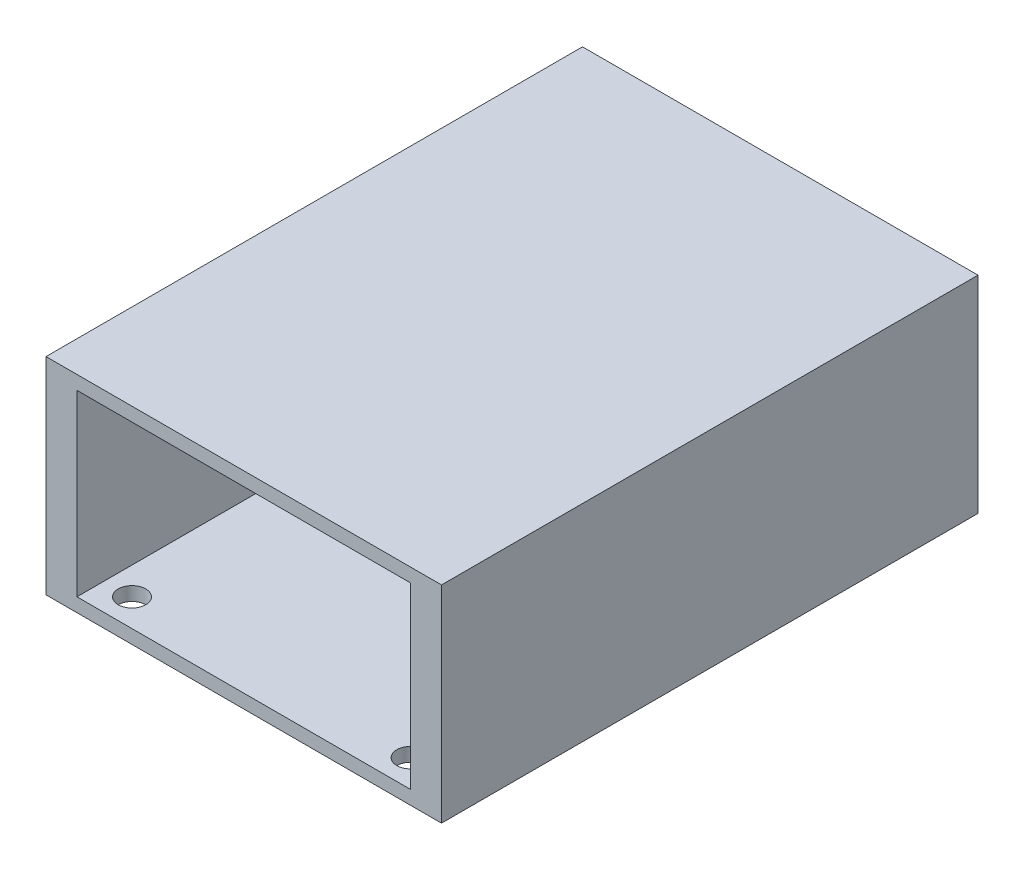
ISO-10303-21;
HEADER;
FILE_DESCRIPTION(('STEP AP214'),'2;1');
FILE_NAME('part.step','',(''),(''),'','','');
FILE_SCHEMA(('AUTOMOTIVE_DESIGN { 1 0 10303 214 1 1 1 1 }'));
ENDSEC;
DATA;
#1=APPLICATION_CONTEXT('core data for automotive mechanical design processes');
#2=APPLICATION_PROTOCOL_DEFINITION('international standard','automotive_design',2000,#1);
#3=PRODUCT_CONTEXT('',#1,'mechanical');
#4=PRODUCT('Part','Part','',(#3));
#5=PRODUCT_RELATED_PRODUCT_CATEGORY('part','',(#4));
#6=PRODUCT_DEFINITION_FORMATION('','',#4);
#7=PRODUCT_DEFINITION_CONTEXT('part definition',#1,'design');
#8=PRODUCT_DEFINITION('design','',#6,#7);
#9=PRODUCT_DEFINITION_SHAPE('','',#8);
#10=(LENGTH_UNIT() NAMED_UNIT(*) SI_UNIT(.MILLI.,.METRE.));
#11=(NAMED_UNIT(*) PLANE_ANGLE_UNIT() SI_UNIT($,.RADIAN.));
#12=(NAMED_UNIT(*) SI_UNIT($,.STERADIAN.) SOLID_ANGLE_UNIT());
#13=UNCERTAINTY_MEASURE_WITH_UNIT(LENGTH_MEASURE(1.E-05),#10,'distance_accuracy_value','');
#14=(GEOMETRIC_REPRESENTATION_CONTEXT(3) GLOBAL_UNCERTAINTY_ASSIGNED_CONTEXT((#13)) GLOBAL_UNIT_ASSIGNED_CONTEXT((#10,
#11,#12)) REPRESENTATION_CONTEXT('',''));
#15=CARTESIAN_POINT('',(0.,0.,0.));
#16=DIRECTION('',(0.,0.,1.));
#17=DIRECTION('',(1.,0.,0.));
#18=AXIS2_PLACEMENT_3D('',#15,#16,#17);
#19=CARTESIAN_POINT('',(-33.5980392156863,30.,-40.2303921568627));
#20=DIRECTION('',(1.,0.,0.));
#21=DIRECTION('',(0.,0.,-1.));
#22=AXIS2_PLACEMENT_3D('',#19,#20,#21);
#23=PLANE('',#22);
#24=DIRECTION('',(0.,0.,1.));
#25=VECTOR('',#24,1.);
#26=CARTESIAN_POINT('',(-33.5980392156863,0.,-40.2303921568627));
#27=LINE('',#26,#25);
#28=CARTESIAN_POINT('',(-33.5980392156863,0.,-40.2303921568627));
#29=VERTEX_POINT('',#28);
#30=CARTESIAN_POINT('',(-33.5980392156863,0.,37.7696078431373));
#31=VERTEX_POINT('',#30);
#32=EDGE_CURVE('E145',#29,#31,#27,.T.);
#33=ORIENTED_EDGE('',*,*,#32,.T.);
#34=DIRECTION('',(0.,-1.,0.));
#35=VECTOR('',#34,1.);
#36=CARTESIAN_POINT('',(-33.5980392156863,30.,37.7696078431373));
#37=LINE('',#36,#35);
#38=CARTESIAN_POINT('',(-33.5980392156863,30.,37.7696078431373));
#39=VERTEX_POINT('',#38);
#40=EDGE_CURVE('E11',#39,#31,#37,.T.);
#41=ORIENTED_EDGE('',*,*,#40,.F.);
#42=DIRECTION('',(0.,0.,1.));
#43=VECTOR('',#42,1.);
#44=CARTESIAN_POINT('',(-33.5980392156863,30.,-40.2303921568627));
#45=LINE('',#44,#43);
#46=CARTESIAN_POINT('',(-33.5980392156863,30.,-40.2303921568627));
#47=VERTEX_POINT('',#46);
#48=EDGE_CURVE('E149',#47,#39,#45,.T.);
#49=ORIENTED_EDGE('',*,*,#48,.F.);
#50=DIRECTION('',(0.,-1.,0.));
#51=VECTOR('',#50,1.);
#52=CARTESIAN_POINT('',(-33.5980392156863,30.,-40.2303921568627));
#53=LINE('',#52,#51);
#54=EDGE_CURVE('E155',#47,#29,#53,.T.);
#55=ORIENTED_EDGE('',*,*,#54,.T.);
#56=EDGE_LOOP('',(#33,#41,#49,#55));
#57=FACE_BOUND('',#56,.T.);
#58=ADVANCED_FACE('F33',(#57),#23,.F.);
#59=CARTESIAN_POINT('',(-33.5980392156863,30.,37.7696078431373));
#60=DIRECTION('',(0.,0.,-1.));
#61=DIRECTION('',(-1.,0.,0.));
#62=AXIS2_PLACEMENT_3D('',#59,#60,#61);
#63=PLANE('',#62);
#64=DIRECTION('',(1.,0.,0.));
#65=VECTOR('',#64,1.);
#66=CARTESIAN_POINT('',(-29.0980392156863,2.,37.7696078431373));
#67=LINE('',#66,#65);
#68=CARTESIAN_POINT('',(-29.0980392156863,2.,37.7696078431373));
#69=VERTEX_POINT('',#68);
#70=CARTESIAN_POINT('',(19.4019607843137,2.,37.7696078431373));
#71=VERTEX_POINT('',#70);
#72=EDGE_CURVE('E138',#69,#71,#67,.T.);
#73=ORIENTED_EDGE('',*,*,#72,.F.);
#74=DIRECTION('',(0.,-1.,0.));
#75=VECTOR('',#74,1.);
#76=CARTESIAN_POINT('',(-29.0980392156863,28.,37.7696078431373));
#77=LINE('',#76,#75);
#78=CARTESIAN_POINT('',(-29.0980392156863,28.,37.7696078431373));
#79=VERTEX_POINT('',#78);
#80=EDGE_CURVE('E47',#79,#69,#77,.T.);
#81=ORIENTED_EDGE('',*,*,#80,.F.);
#82=DIRECTION('',(-1.,0.,0.));
#83=VECTOR('',#82,1.);
#84=CARTESIAN_POINT('',(-29.0980392156863,28.,37.7696078431373));
#85=LINE('',#84,#83);
#86=CARTESIAN_POINT('',(19.4019607843137,28.,37.7696078431373));
#87=VERTEX_POINT('',#86);
#88=EDGE_CURVE('E126',#87,#79,#85,.T.);
#89=ORIENTED_EDGE('',*,*,#88,.F.);
#90=DIRECTION('',(0.,1.,0.));
#91=VECTOR('',#90,1.);
#92=CARTESIAN_POINT('',(19.4019607843137,28.,37.7696078431373));
#93=LINE('',#92,#91);
#94=EDGE_CURVE('E129',#71,#87,#93,.T.);
#95=ORIENTED_EDGE('',*,*,#94,.F.);
#96=EDGE_LOOP('',(#73,#81,#89,#95));
#97=FACE_BOUND('',#96,.T.);
#98=DIRECTION('',(1.,0.,0.));
#99=VECTOR('',#98,1.);
#100=CARTESIAN_POINT('',(-33.5980392156863,0.,37.7696078431373));
#101=LINE('',#100,#99);
#102=CARTESIAN_POINT('',(23.9019607843137,0.,37.7696078431373));
#103=VERTEX_POINT('',#102);
#104=EDGE_CURVE('E158',#31,#103,#101,.T.);
#105=ORIENTED_EDGE('',*,*,#104,.T.);
#106=DIRECTION('',(0.,-1.,0.));
#107=VECTOR('',#106,1.);
#108=CARTESIAN_POINT('',(23.9019607843137,30.,37.7696078431373));
#109=LINE('',#108,#107);
#110=CARTESIAN_POINT('',(23.9019607843137,30.,37.7696078431373));
#111=VERTEX_POINT('',#110);
#112=EDGE_CURVE('E40',#111,#103,#109,.T.);
#113=ORIENTED_EDGE('',*,*,#112,.F.);
#114=DIRECTION('',(1.,0.,0.));
#115=VECTOR('',#114,1.);
#116=CARTESIAN_POINT('',(-33.5980392156863,30.,37.7696078431373));
#117=LINE('',#116,#115);
#118=EDGE_CURVE('E84',#39,#111,#117,.T.);
#119=ORIENTED_EDGE('',*,*,#118,.F.);
#120=ORIENTED_EDGE('',*,*,#40,.T.);
#121=EDGE_LOOP('',(#105,#113,#119,#120));
#122=FACE_BOUND('',#121,.T.);
#123=ADVANCED_FACE('F186',(#97,#122),#63,.F.);
#124=CARTESIAN_POINT('',(23.9019607843137,30.,-40.2303921568627));
#125=DIRECTION('',(-1.,0.,0.));
#126=DIRECTION('',(0.,0.,1.));
#127=AXIS2_PLACEMENT_3D('',#124,#125,#126);
#128=PLANE('',#127);
#129=DIRECTION('',(0.,0.,-1.));
#130=VECTOR('',#129,1.);
#131=CARTESIAN_POINT('',(23.9019607843137,0.,-40.2303921568627));
#132=LINE('',#131,#130);
#133=CARTESIAN_POINT('',(23.9019607843137,0.,-40.2303921568627));
#134=VERTEX_POINT('',#133);
#135=EDGE_CURVE('E160',#103,#134,#132,.T.);
#136=ORIENTED_EDGE('',*,*,#135,.T.);
#137=DIRECTION('',(0.,-1.,0.));
#138=VECTOR('',#137,1.);
#139=CARTESIAN_POINT('',(23.9019607843137,30.,-40.2303921568627));
#140=LINE('',#139,#138);
#141=CARTESIAN_POINT('',(23.9019607843137,30.,-40.2303921568627));
#142=VERTEX_POINT('',#141);
#143=EDGE_CURVE('E164',#142,#134,#140,.T.);
#144=ORIENTED_EDGE('',*,*,#143,.F.);
#145=DIRECTION('',(0.,0.,-1.));
#146=VECTOR('',#145,1.);
#147=CARTESIAN_POINT('',(23.9019607843137,30.,-40.2303921568627));
#148=LINE('',#147,#146);
#149=EDGE_CURVE('E152',#111,#142,#148,.T.);
#150=ORIENTED_EDGE('',*,*,#149,.F.);
#151=ORIENTED_EDGE('',*,*,#112,.T.);
#152=EDGE_LOOP('',(#136,#144,#150,#151));
#153=FACE_BOUND('',#152,.T.);
#154=ADVANCED_FACE('F169',(#153),#128,.F.);
#155=CARTESIAN_POINT('',(-33.5980392156863,30.,-40.2303921568627));
#156=DIRECTION('',(0.,0.,1.));
#157=DIRECTION('',(1.,0.,0.));
#158=AXIS2_PLACEMENT_3D('',#155,#156,#157);
#159=PLANE('',#158);
#160=DIRECTION('',(-1.,0.,0.));
#161=VECTOR('',#160,1.);
#162=CARTESIAN_POINT('',(-33.5980392156863,0.,-40.2303921568627));
#163=LINE('',#162,#161);
#164=EDGE_CURVE('E77',#134,#29,#163,.T.);
#165=ORIENTED_EDGE('',*,*,#164,.T.);
#166=ORIENTED_EDGE('',*,*,#54,.F.);
#167=DIRECTION('',(-1.,0.,0.));
#168=VECTOR('',#167,1.);
#169=CARTESIAN_POINT('',(-33.5980392156863,30.,-40.2303921568627));
#170=LINE('',#169,#168);
#171=EDGE_CURVE('E56',#142,#47,#170,.T.);
#172=ORIENTED_EDGE('',*,*,#171,.F.);
#173=ORIENTED_EDGE('',*,*,#143,.T.);
#174=EDGE_LOOP('',(#165,#166,#172,#173));
#175=FACE_BOUND('',#174,.T.);
#176=ADVANCED_FACE('F177',(#175),#159,.F.);
#177=CARTESIAN_POINT('',(0.,30.,0.));
#178=DIRECTION('',(0.,1.,0.));
#179=DIRECTION('',(0.,0.,1.));
#180=AXIS2_PLACEMENT_3D('',#177,#178,#179);
#181=PLANE('',#180);
#182=ORIENTED_EDGE('',*,*,#48,.T.);
#183=ORIENTED_EDGE('',*,*,#118,.T.);
#184=ORIENTED_EDGE('',*,*,#149,.T.);
#185=ORIENTED_EDGE('',*,*,#171,.T.);
#186=EDGE_LOOP('',(#182,#183,#184,#185));
#187=FACE_BOUND('',#186,.T.);
#188=ADVANCED_FACE('F179',(#187),#181,.T.);
#189=CARTESIAN_POINT('',(0.,0.,0.));
#190=DIRECTION('',(0.,1.,0.));
#191=DIRECTION('',(0.,0.,1.));
#192=AXIS2_PLACEMENT_3D('',#189,#190,#191);
#193=PLANE('',#192);
#194=CARTESIAN_POINT('',(-25.0980392156863,0.,33.7696078431373));
#195=DIRECTION('',(0.,1.,0.));
#196=DIRECTION('',(0.,0.,1.));
#197=AXIS2_PLACEMENT_3D('',#194,#195,#196);
#198=CIRCLE('',#197,2.00000000000001);
#199=CARTESIAN_POINT('',(-25.0980392156863,0.,35.7696078431373));
#200=VERTEX_POINT('',#199);
#201=EDGE_CURVE('E222',#200,#200,#198,.T.);
#202=ORIENTED_EDGE('',*,*,#201,.T.);
#203=EDGE_LOOP('',(#202));
#204=FACE_BOUND('',#203,.T.);
#205=CARTESIAN_POINT('',(-25.0980392156863,0.,-34.2303921568628));
#206=DIRECTION('',(0.,1.,0.));
#207=DIRECTION('',(0.,0.,1.));
#208=AXIS2_PLACEMENT_3D('',#205,#206,#207);
#209=CIRCLE('',#208,1.);
#210=CARTESIAN_POINT('',(-25.0980392156863,0.,-33.2303921568628));
#211=VERTEX_POINT('',#210);
#212=EDGE_CURVE('E226',#211,#211,#209,.T.);
#213=ORIENTED_EDGE('',*,*,#212,.T.);
#214=EDGE_LOOP('',(#213));
#215=FACE_BOUND('',#214,.T.);
#216=CARTESIAN_POINT('',(15.4019607843137,0.,33.7696078431373));
#217=DIRECTION('',(0.,1.,0.));
#218=DIRECTION('',(0.,0.,1.));
#219=AXIS2_PLACEMENT_3D('',#216,#217,#218);
#220=CIRCLE('',#219,2.);
#221=CARTESIAN_POINT('',(15.4019607843137,0.,35.7696078431373));
#222=VERTEX_POINT('',#221);
#223=EDGE_CURVE('E139',#222,#222,#220,.T.);
#224=ORIENTED_EDGE('',*,*,#223,.T.);
#225=EDGE_LOOP('',(#224));
#226=FACE_BOUND('',#225,.T.);
#227=ORIENTED_EDGE('',*,*,#32,.F.);
#228=ORIENTED_EDGE('',*,*,#164,.F.);
#229=ORIENTED_EDGE('',*,*,#135,.F.);
#230=ORIENTED_EDGE('',*,*,#104,.F.);
#231=EDGE_LOOP('',(#227,#228,#229,#230));
#232=FACE_BOUND('',#231,.T.);
#233=ADVANCED_FACE('F173',(#204,#215,#226,#232),#193,.F.);
#234=CARTESIAN_POINT('',(-29.0980392156863,28.,-38.2303921568628));
#235=DIRECTION('',(-1.,0.,0.));
#236=DIRECTION('',(0.,-1.,0.));
#237=AXIS2_PLACEMENT_3D('',#234,#235,#236);
#238=PLANE('',#237);
#239=ORIENTED_EDGE('',*,*,#80,.T.);
#240=DIRECTION('',(0.,0.,1.));
#241=VECTOR('',#240,1.);
#242=CARTESIAN_POINT('',(-29.0980392156863,2.,-38.2303921568628));
#243=LINE('',#242,#241);
#244=CARTESIAN_POINT('',(-29.0980392156863,2.,-38.2303921568628));
#245=VERTEX_POINT('',#244);
#246=EDGE_CURVE('E104',#245,#69,#243,.T.);
#247=ORIENTED_EDGE('',*,*,#246,.F.);
#248=DIRECTION('',(0.,-1.,0.));
#249=VECTOR('',#248,1.);
#250=CARTESIAN_POINT('',(-29.0980392156863,28.,-38.2303921568628));
#251=LINE('',#250,#249);
#252=CARTESIAN_POINT('',(-29.0980392156863,28.,-38.2303921568628));
#253=VERTEX_POINT('',#252);
#254=EDGE_CURVE('E108',#253,#245,#251,.T.);
#255=ORIENTED_EDGE('',*,*,#254,.F.);
#256=DIRECTION('',(0.,0.,1.));
#257=VECTOR('',#256,1.);
#258=CARTESIAN_POINT('',(-29.0980392156863,28.,-38.2303921568628));
#259=LINE('',#258,#257);
#260=EDGE_CURVE('E143',#253,#79,#259,.T.);
#261=ORIENTED_EDGE('',*,*,#260,.T.);
#262=EDGE_LOOP('',(#239,#247,#255,#261));
#263=FACE_BOUND('',#262,.T.);
#264=ADVANCED_FACE('F106',(#263),#238,.F.);
#265=CARTESIAN_POINT('',(-29.0980392156863,28.,-38.2303921568628));
#266=DIRECTION('',(0.,1.,0.));
#267=DIRECTION('',(0.,0.,1.));
#268=AXIS2_PLACEMENT_3D('',#265,#266,#267);
#269=PLANE('',#268);
#270=ORIENTED_EDGE('',*,*,#88,.T.);
#271=ORIENTED_EDGE('',*,*,#260,.F.);
#272=DIRECTION('',(-1.,0.,0.));
#273=VECTOR('',#272,1.);
#274=CARTESIAN_POINT('',(-29.0980392156863,28.,-38.2303921568628));
#275=LINE('',#274,#273);
#276=CARTESIAN_POINT('',(19.4019607843137,28.,-38.2303921568628));
#277=VERTEX_POINT('',#276);
#278=EDGE_CURVE('E114',#277,#253,#275,.T.);
#279=ORIENTED_EDGE('',*,*,#278,.F.);
#280=DIRECTION('',(0.,0.,1.));
#281=VECTOR('',#280,1.);
#282=CARTESIAN_POINT('',(19.4019607843137,28.,-38.2303921568628));
#283=LINE('',#282,#281);
#284=EDGE_CURVE('E146',#277,#87,#283,.T.);
#285=ORIENTED_EDGE('',*,*,#284,.T.);
#286=EDGE_LOOP('',(#270,#271,#279,#285));
#287=FACE_BOUND('',#286,.T.);
#288=ADVANCED_FACE('F201',(#287),#269,.F.);
#289=CARTESIAN_POINT('',(19.4019607843137,28.,-38.2303921568628));
#290=DIRECTION('',(1.,0.,0.));
#291=DIRECTION('',(0.,1.,0.));
#292=AXIS2_PLACEMENT_3D('',#289,#290,#291);
#293=PLANE('',#292);
#294=ORIENTED_EDGE('',*,*,#94,.T.);
#295=ORIENTED_EDGE('',*,*,#284,.F.);
#296=DIRECTION('',(0.,1.,0.));
#297=VECTOR('',#296,1.);
#298=CARTESIAN_POINT('',(19.4019607843137,28.,-38.2303921568628));
#299=LINE('',#298,#297);
#300=CARTESIAN_POINT('',(19.4019607843137,2.,-38.2303921568628));
#301=VERTEX_POINT('',#300);
#302=EDGE_CURVE('E122',#301,#277,#299,.T.);
#303=ORIENTED_EDGE('',*,*,#302,.F.);
#304=DIRECTION('',(0.,0.,1.));
#305=VECTOR('',#304,1.);
#306=CARTESIAN_POINT('',(19.4019607843137,2.,-38.2303921568628));
#307=LINE('',#306,#305);
#308=EDGE_CURVE('E113',#301,#71,#307,.T.);
#309=ORIENTED_EDGE('',*,*,#308,.T.);
#310=EDGE_LOOP('',(#294,#295,#303,#309));
#311=FACE_BOUND('',#310,.T.);
#312=ADVANCED_FACE('F199',(#311),#293,.F.);
#313=CARTESIAN_POINT('',(-29.0980392156863,2.,-38.2303921568628));
#314=DIRECTION('',(0.,-1.,0.));
#315=DIRECTION('',(0.,0.,-1.));
#316=AXIS2_PLACEMENT_3D('',#313,#314,#315);
#317=PLANE('',#316);
#318=CARTESIAN_POINT('',(-25.0980392156863,2.,33.7696078431373));
#319=DIRECTION('',(0.,1.,0.));
#320=DIRECTION('',(0.,0.,1.));
#321=AXIS2_PLACEMENT_3D('',#318,#319,#320);
#322=CIRCLE('',#321,2.00000000000001);
#323=CARTESIAN_POINT('',(-25.0980392156863,2.,35.7696078431373));
#324=VERTEX_POINT('',#323);
#325=EDGE_CURVE('E236',#324,#324,#322,.T.);
#326=ORIENTED_EDGE('',*,*,#325,.F.);
#327=EDGE_LOOP('',(#326));
#328=FACE_BOUND('',#327,.T.);
#329=CARTESIAN_POINT('',(-25.0980392156863,2.,-34.2303921568628));
#330=DIRECTION('',(0.,1.,0.));
#331=DIRECTION('',(0.,0.,1.));
#332=AXIS2_PLACEMENT_3D('',#329,#330,#331);
#333=CIRCLE('',#332,1.);
#334=CARTESIAN_POINT('',(-25.0980392156863,2.,-33.2303921568628));
#335=VERTEX_POINT('',#334);
#336=EDGE_CURVE('E232',#335,#335,#333,.T.);
#337=ORIENTED_EDGE('',*,*,#336,.F.);
#338=EDGE_LOOP('',(#337));
#339=FACE_BOUND('',#338,.T.);
#340=CARTESIAN_POINT('',(15.4019607843137,2.,33.7696078431373));
#341=DIRECTION('',(0.,1.,0.));
#342=DIRECTION('',(0.,0.,1.));
#343=AXIS2_PLACEMENT_3D('',#340,#341,#342);
#344=CIRCLE('',#343,2.);
#345=CARTESIAN_POINT('',(15.4019607843137,2.,35.7696078431373));
#346=VERTEX_POINT('',#345);
#347=EDGE_CURVE('E132',#346,#346,#344,.T.);
#348=ORIENTED_EDGE('',*,*,#347,.F.);
#349=EDGE_LOOP('',(#348));
#350=FACE_BOUND('',#349,.T.);
#351=ORIENTED_EDGE('',*,*,#72,.T.);
#352=ORIENTED_EDGE('',*,*,#308,.F.);
#353=DIRECTION('',(1.,0.,0.));
#354=VECTOR('',#353,1.);
#355=CARTESIAN_POINT('',(-29.0980392156863,2.,-38.2303921568628));
#356=LINE('',#355,#354);
#357=EDGE_CURVE('E117',#245,#301,#356,.T.);
#358=ORIENTED_EDGE('',*,*,#357,.F.);
#359=ORIENTED_EDGE('',*,*,#246,.T.);
#360=EDGE_LOOP('',(#351,#352,#358,#359));
#361=FACE_BOUND('',#360,.T.);
#362=ADVANCED_FACE('F118',(#328,#339,#350,#361),#317,.F.);
#363=CARTESIAN_POINT('',(0.,0.,-38.2303921568628));
#364=DIRECTION('',(0.,0.,1.));
#365=DIRECTION('',(1.,0.,0.));
#366=AXIS2_PLACEMENT_3D('',#363,#364,#365);
#367=PLANE('',#366);
#368=ORIENTED_EDGE('',*,*,#254,.T.);
#369=ORIENTED_EDGE('',*,*,#357,.T.);
#370=ORIENTED_EDGE('',*,*,#302,.T.);
#371=ORIENTED_EDGE('',*,*,#278,.T.);
#372=EDGE_LOOP('',(#368,#369,#370,#371));
#373=FACE_BOUND('',#372,.T.);
#374=ADVANCED_FACE('F124',(#373),#367,.T.);
#375=CARTESIAN_POINT('',(15.4019607843137,0.,33.7696078431373));
#376=DIRECTION('',(0.,1.,0.));
#377=DIRECTION('',(0.,0.,1.));
#378=AXIS2_PLACEMENT_3D('',#375,#376,#377);
#379=CYLINDRICAL_SURFACE('',#378,2.);
#380=ORIENTED_EDGE('',*,*,#223,.F.);
#381=EDGE_LOOP('',(#380));
#382=FACE_BOUND('',#381,.T.);
#383=ORIENTED_EDGE('',*,*,#347,.T.);
#384=EDGE_LOOP('',(#383));
#385=FACE_BOUND('',#384,.T.);
#386=ADVANCED_FACE('F247',(#382,#385),#379,.F.);
#387=CARTESIAN_POINT('',(-25.0980392156863,0.,-34.2303921568628));
#388=DIRECTION('',(0.,1.,0.));
#389=DIRECTION('',(0.,0.,1.));
#390=AXIS2_PLACEMENT_3D('',#387,#388,#389);
#391=CYLINDRICAL_SURFACE('',#390,1.);
#392=ORIENTED_EDGE('',*,*,#212,.F.);
#393=EDGE_LOOP('',(#392));
#394=FACE_BOUND('',#393,.T.);
#395=ORIENTED_EDGE('',*,*,#336,.T.);
#396=EDGE_LOOP('',(#395));
#397=FACE_BOUND('',#396,.T.);
#398=ADVANCED_FACE('F249',(#394,#397),#391,.F.);
#399=CARTESIAN_POINT('',(-25.0980392156863,0.,33.7696078431373));
#400=DIRECTION('',(0.,1.,0.));
#401=DIRECTION('',(0.,0.,1.));
#402=AXIS2_PLACEMENT_3D('',#399,#400,#401);
#403=CYLINDRICAL_SURFACE('',#402,2.00000000000001);
#404=ORIENTED_EDGE('',*,*,#201,.F.);
#405=EDGE_LOOP('',(#404));
#406=FACE_BOUND('',#405,.T.);
#407=ORIENTED_EDGE('',*,*,#325,.T.);
#408=EDGE_LOOP('',(#407));
#409=FACE_BOUND('',#408,.T.);
#410=ADVANCED_FACE('F241',(#406,#409),#403,.F.);
#411=CLOSED_SHELL('',(#58,#123,#154,#176,#188,#233,#264,#288,#312,#362,#374,#386,#398,#410));
#412=MANIFOLD_SOLID_BREP('B2',#411);
#413=ADVANCED_BREP_SHAPE_REPRESENTATION('',(#18,#412),#14);
#414=SHAPE_DEFINITION_REPRESENTATION(#9,#413);
ENDSEC;
END-ISO-10303-21;
